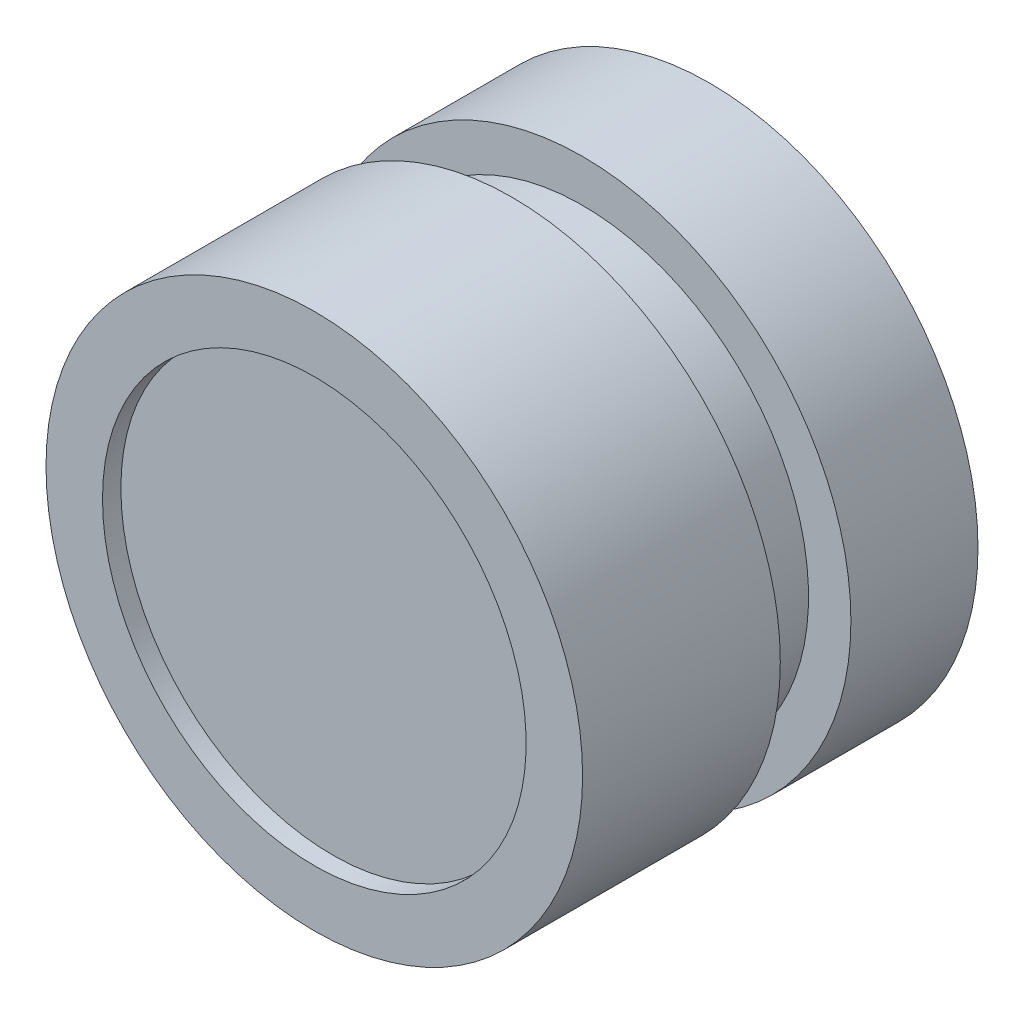
ISO-10303-21;
HEADER;
FILE_DESCRIPTION(('STEP AP214'),'2;1');
FILE_NAME('part.step','',(''),(''),'','','');
FILE_SCHEMA(('AUTOMOTIVE_DESIGN { 1 0 10303 214 1 1 1 1 }'));
ENDSEC;
DATA;
#1=APPLICATION_CONTEXT('core data for automotive mechanical design processes');
#2=APPLICATION_PROTOCOL_DEFINITION('international standard','automotive_design',2000,#1);
#3=PRODUCT_CONTEXT('',#1,'mechanical');
#4=PRODUCT('Part','Part','',(#3));
#5=PRODUCT_RELATED_PRODUCT_CATEGORY('part','',(#4));
#6=PRODUCT_DEFINITION_FORMATION('','',#4);
#7=PRODUCT_DEFINITION_CONTEXT('part definition',#1,'design');
#8=PRODUCT_DEFINITION('design','',#6,#7);
#9=PRODUCT_DEFINITION_SHAPE('','',#8);
#10=(LENGTH_UNIT() NAMED_UNIT(*) SI_UNIT(.MILLI.,.METRE.));
#11=(NAMED_UNIT(*) PLANE_ANGLE_UNIT() SI_UNIT($,.RADIAN.));
#12=(NAMED_UNIT(*) SI_UNIT($,.STERADIAN.) SOLID_ANGLE_UNIT());
#13=UNCERTAINTY_MEASURE_WITH_UNIT(LENGTH_MEASURE(1.E-05),#10,'distance_accuracy_value','');
#14=(GEOMETRIC_REPRESENTATION_CONTEXT(3) GLOBAL_UNCERTAINTY_ASSIGNED_CONTEXT((#13)) GLOBAL_UNIT_ASSIGNED_CONTEXT((#10,
#11,#12)) REPRESENTATION_CONTEXT('',''));
#15=CARTESIAN_POINT('',(0.,0.,0.));
#16=DIRECTION('',(0.,0.,1.));
#17=DIRECTION('',(1.,0.,0.));
#18=AXIS2_PLACEMENT_3D('',#15,#16,#17);
#19=CARTESIAN_POINT('',(9.5,0.,0.));
#20=DIRECTION('',(0.,0.,-1.));
#21=DIRECTION('',(-1.,0.,0.));
#22=AXIS2_PLACEMENT_3D('',#19,#20,#21);
#23=PLANE('',#22);
#24=CARTESIAN_POINT('',(0.,0.,0.));
#25=DIRECTION('',(0.,0.,-1.));
#26=DIRECTION('',(-1.,0.,0.));
#27=AXIS2_PLACEMENT_3D('',#24,#25,#26);
#28=CIRCLE('',#27,9.5);
#29=CARTESIAN_POINT('',(-9.5,0.,0.));
#30=VERTEX_POINT('',#29);
#31=EDGE_CURVE('E65',#30,#30,#28,.T.);
#32=ORIENTED_EDGE('',*,*,#31,.F.);
#33=EDGE_LOOP('',(#32));
#34=FACE_BOUND('',#33,.T.);
#35=CARTESIAN_POINT('',(0.,0.,0.));
#36=DIRECTION('',(0.,0.,-1.));
#37=DIRECTION('',(-1.,0.,0.));
#38=AXIS2_PLACEMENT_3D('',#35,#36,#37);
#39=CIRCLE('',#38,7.5);
#40=CARTESIAN_POINT('',(-7.5,0.,0.));
#41=VERTEX_POINT('',#40);
#42=EDGE_CURVE('E10',#41,#41,#39,.T.);
#43=ORIENTED_EDGE('',*,*,#42,.T.);
#44=EDGE_LOOP('',(#43));
#45=FACE_BOUND('',#44,.T.);
#46=ADVANCED_FACE('F37',(#34,#45),#23,.F.);
#47=CARTESIAN_POINT('',(0.,0.,-14.));
#48=DIRECTION('',(0.,0.,-1.));
#49=DIRECTION('',(-1.,0.,0.));
#50=AXIS2_PLACEMENT_3D('',#47,#48,#49);
#51=CYLINDRICAL_SURFACE('',#50,7.5);
#52=ORIENTED_EDGE('',*,*,#42,.F.);
#53=EDGE_LOOP('',(#52));
#54=FACE_BOUND('',#53,.T.);
#55=CARTESIAN_POINT('',(0.,0.,-0.650885226613392));
#56=DIRECTION('',(0.,0.,-1.));
#57=DIRECTION('',(-1.,0.,0.));
#58=AXIS2_PLACEMENT_3D('',#55,#56,#57);
#59=CIRCLE('',#58,7.5);
#60=CARTESIAN_POINT('',(-7.5,0.,-0.65088522661339));
#61=VERTEX_POINT('',#60);
#62=EDGE_CURVE('E43',#61,#61,#59,.T.);
#63=ORIENTED_EDGE('',*,*,#62,.T.);
#64=EDGE_LOOP('',(#63));
#65=FACE_BOUND('',#64,.T.);
#66=ADVANCED_FACE('F72',(#54,#65),#51,.F.);
#67=CARTESIAN_POINT('',(7.5,0.,-0.650885226613393));
#68=DIRECTION('',(0.,0.,-1.));
#69=DIRECTION('',(-1.,0.,0.));
#70=AXIS2_PLACEMENT_3D('',#67,#68,#69);
#71=PLANE('',#70);
#72=ORIENTED_EDGE('',*,*,#62,.F.);
#73=EDGE_LOOP('',(#72));
#74=FACE_BOUND('',#73,.T.);
#75=ADVANCED_FACE('F76',(#74),#71,.F.);
#76=CARTESIAN_POINT('',(0.,0.,-14.));
#77=DIRECTION('',(0.,0.,1.));
#78=DIRECTION('',(1.,0.,0.));
#79=AXIS2_PLACEMENT_3D('',#76,#77,#78);
#80=PLANE('',#79);
#81=CARTESIAN_POINT('',(0.,0.,-14.));
#82=DIRECTION('',(0.,0.,-1.));
#83=DIRECTION('',(-1.,0.,0.));
#84=AXIS2_PLACEMENT_3D('',#81,#82,#83);
#85=CIRCLE('',#84,9.5);
#86=CARTESIAN_POINT('',(-9.5,0.,-14.));
#87=VERTEX_POINT('',#86);
#88=EDGE_CURVE('E47',#87,#87,#85,.T.);
#89=ORIENTED_EDGE('',*,*,#88,.T.);
#90=EDGE_LOOP('',(#89));
#91=FACE_BOUND('',#90,.T.);
#92=ADVANCED_FACE('F81',(#91),#80,.F.);
#93=CARTESIAN_POINT('',(0.,0.,-14.));
#94=DIRECTION('',(0.,0.,-1.));
#95=DIRECTION('',(-1.,0.,0.));
#96=AXIS2_PLACEMENT_3D('',#93,#94,#95);
#97=CYLINDRICAL_SURFACE('',#96,9.5);
#98=ORIENTED_EDGE('',*,*,#88,.F.);
#99=EDGE_LOOP('',(#98));
#100=FACE_BOUND('',#99,.T.);
#101=CARTESIAN_POINT('',(0.,0.,-9.5));
#102=DIRECTION('',(0.,0.,-1.));
#103=DIRECTION('',(-1.,0.,0.));
#104=AXIS2_PLACEMENT_3D('',#101,#102,#103);
#105=CIRCLE('',#104,9.5);
#106=CARTESIAN_POINT('',(-9.5,0.,-9.5));
#107=VERTEX_POINT('',#106);
#108=EDGE_CURVE('E51',#107,#107,#105,.T.);
#109=ORIENTED_EDGE('',*,*,#108,.T.);
#110=EDGE_LOOP('',(#109));
#111=FACE_BOUND('',#110,.T.);
#112=ADVANCED_FACE('F87',(#100,#111),#97,.T.);
#113=CARTESIAN_POINT('',(9.5,0.,-9.5));
#114=DIRECTION('',(0.,0.,-1.));
#115=DIRECTION('',(-1.,0.,0.));
#116=AXIS2_PLACEMENT_3D('',#113,#114,#115);
#117=PLANE('',#116);
#118=ORIENTED_EDGE('',*,*,#108,.F.);
#119=EDGE_LOOP('',(#118));
#120=FACE_BOUND('',#119,.T.);
#121=CARTESIAN_POINT('',(0.,0.,-9.5));
#122=DIRECTION('',(0.,0.,-1.));
#123=DIRECTION('',(-1.,0.,0.));
#124=AXIS2_PLACEMENT_3D('',#121,#122,#123);
#125=CIRCLE('',#124,8.);
#126=CARTESIAN_POINT('',(-8.,0.,-9.5));
#127=VERTEX_POINT('',#126);
#128=EDGE_CURVE('E56',#127,#127,#125,.T.);
#129=ORIENTED_EDGE('',*,*,#128,.T.);
#130=EDGE_LOOP('',(#129));
#131=FACE_BOUND('',#130,.T.);
#132=ADVANCED_FACE('F91',(#120,#131),#117,.F.);
#133=CARTESIAN_POINT('',(0.,0.,-14.));
#134=DIRECTION('',(0.,0.,-1.));
#135=DIRECTION('',(-1.,0.,0.));
#136=AXIS2_PLACEMENT_3D('',#133,#134,#135);
#137=CYLINDRICAL_SURFACE('',#136,8.);
#138=ORIENTED_EDGE('',*,*,#128,.F.);
#139=EDGE_LOOP('',(#138));
#140=FACE_BOUND('',#139,.T.);
#141=CARTESIAN_POINT('',(0.,0.,-7.));
#142=DIRECTION('',(0.,0.,-1.));
#143=DIRECTION('',(-1.,0.,0.));
#144=AXIS2_PLACEMENT_3D('',#141,#142,#143);
#145=CIRCLE('',#144,8.);
#146=CARTESIAN_POINT('',(-8.,0.,-7.));
#147=VERTEX_POINT('',#146);
#148=EDGE_CURVE('E59',#147,#147,#145,.T.);
#149=ORIENTED_EDGE('',*,*,#148,.T.);
#150=EDGE_LOOP('',(#149));
#151=FACE_BOUND('',#150,.T.);
#152=ADVANCED_FACE('F95',(#140,#151),#137,.T.);
#153=CARTESIAN_POINT('',(7.99999999999999,0.,-7.));
#154=DIRECTION('',(0.,0.,1.));
#155=DIRECTION('',(1.,0.,0.));
#156=AXIS2_PLACEMENT_3D('',#153,#154,#155);
#157=PLANE('',#156);
#158=ORIENTED_EDGE('',*,*,#148,.F.);
#159=EDGE_LOOP('',(#158));
#160=FACE_BOUND('',#159,.T.);
#161=CARTESIAN_POINT('',(0.,0.,-7.));
#162=DIRECTION('',(0.,0.,-1.));
#163=DIRECTION('',(-1.,0.,0.));
#164=AXIS2_PLACEMENT_3D('',#161,#162,#163);
#165=CIRCLE('',#164,9.5);
#166=CARTESIAN_POINT('',(-9.5,0.,-6.99999999999999));
#167=VERTEX_POINT('',#166);
#168=EDGE_CURVE('E62',#167,#167,#165,.T.);
#169=ORIENTED_EDGE('',*,*,#168,.T.);
#170=EDGE_LOOP('',(#169));
#171=FACE_BOUND('',#170,.T.);
#172=ADVANCED_FACE('F99',(#160,#171),#157,.F.);
#173=CARTESIAN_POINT('',(0.,0.,-14.));
#174=DIRECTION('',(0.,0.,-1.));
#175=DIRECTION('',(-1.,0.,0.));
#176=AXIS2_PLACEMENT_3D('',#173,#174,#175);
#177=CYLINDRICAL_SURFACE('',#176,9.5);
#178=ORIENTED_EDGE('',*,*,#168,.F.);
#179=EDGE_LOOP('',(#178));
#180=FACE_BOUND('',#179,.T.);
#181=ORIENTED_EDGE('',*,*,#31,.T.);
#182=EDGE_LOOP('',(#181));
#183=FACE_BOUND('',#182,.T.);
#184=ADVANCED_FACE('F69',(#180,#183),#177,.T.);
#185=CLOSED_SHELL('',(#46,#66,#75,#92,#112,#132,#152,#172,#184));
#186=MANIFOLD_SOLID_BREP('B2',#185);
#187=ADVANCED_BREP_SHAPE_REPRESENTATION('',(#18,#186),#14);
#188=SHAPE_DEFINITION_REPRESENTATION(#9,#187);
ENDSEC;
END-ISO-10303-21;
